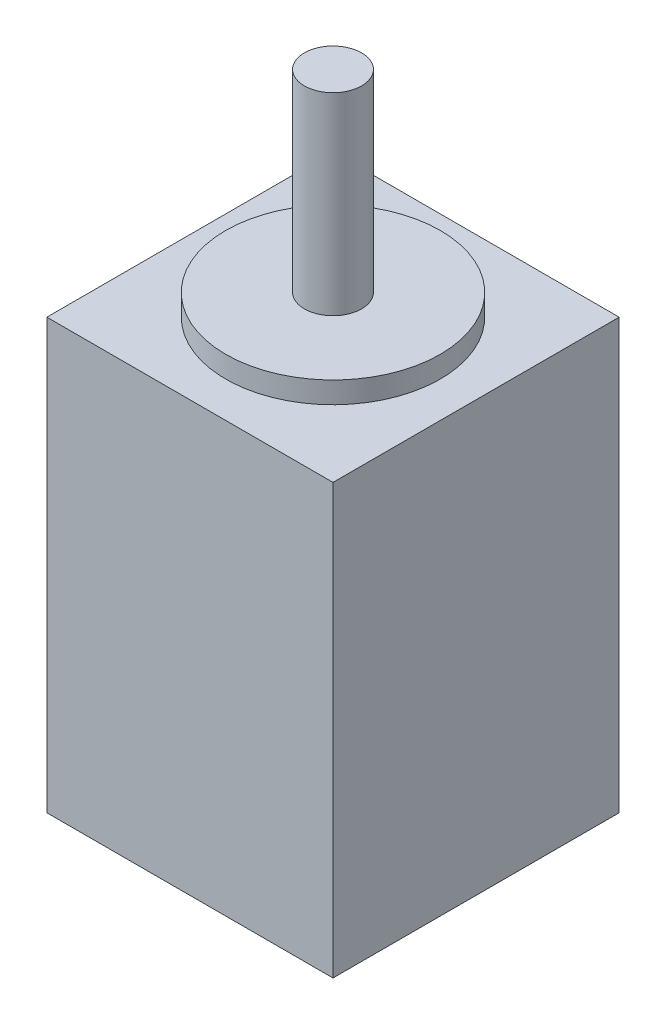
ISO-10303-21;
HEADER;
FILE_DESCRIPTION(('STEP AP214'),'2;1');
FILE_NAME('part.step','',(''),(''),'','','');
FILE_SCHEMA(('AUTOMOTIVE_DESIGN { 1 0 10303 214 1 1 1 1 }'));
ENDSEC;
DATA;
#1=APPLICATION_CONTEXT('core data for automotive mechanical design processes');
#2=APPLICATION_PROTOCOL_DEFINITION('international standard','automotive_design',2000,#1);
#3=PRODUCT_CONTEXT('',#1,'mechanical');
#4=PRODUCT('Part','Part','',(#3));
#5=PRODUCT_RELATED_PRODUCT_CATEGORY('part','',(#4));
#6=PRODUCT_DEFINITION_FORMATION('','',#4);
#7=PRODUCT_DEFINITION_CONTEXT('part definition',#1,'design');
#8=PRODUCT_DEFINITION('design','',#6,#7);
#9=PRODUCT_DEFINITION_SHAPE('','',#8);
#10=(LENGTH_UNIT() NAMED_UNIT(*) SI_UNIT(.MILLI.,.METRE.));
#11=(NAMED_UNIT(*) PLANE_ANGLE_UNIT() SI_UNIT($,.RADIAN.));
#12=(NAMED_UNIT(*) SI_UNIT($,.STERADIAN.) SOLID_ANGLE_UNIT());
#13=UNCERTAINTY_MEASURE_WITH_UNIT(LENGTH_MEASURE(1.E-05),#10,'distance_accuracy_value','');
#14=(GEOMETRIC_REPRESENTATION_CONTEXT(3) GLOBAL_UNCERTAINTY_ASSIGNED_CONTEXT((#13)) GLOBAL_UNIT_ASSIGNED_CONTEXT((#10,
#11,#12)) REPRESENTATION_CONTEXT('',''));
#15=CARTESIAN_POINT('',(0.,0.,0.));
#16=DIRECTION('',(0.,0.,1.));
#17=DIRECTION('',(1.,0.,0.));
#18=AXIS2_PLACEMENT_3D('',#15,#16,#17);
#19=CARTESIAN_POINT('',(10.,31.5,-10.));
#20=DIRECTION('',(0.,1.,0.));
#21=DIRECTION('',(0.,0.,1.));
#22=AXIS2_PLACEMENT_3D('',#19,#20,#21);
#23=PLANE('',#22);
#24=CARTESIAN_POINT('',(10.,31.5,-10.));
#25=DIRECTION('',(0.,1.,0.));
#26=DIRECTION('',(0.,0.,1.));
#27=AXIS2_PLACEMENT_3D('',#24,#25,#26);
#28=CIRCLE('',#27,7.5);
#29=CARTESIAN_POINT('',(10.,31.5,-2.5));
#30=VERTEX_POINT('',#29);
#31=EDGE_CURVE('E104',#30,#30,#28,.T.);
#32=ORIENTED_EDGE('',*,*,#31,.T.);
#33=EDGE_LOOP('',(#32));
#34=FACE_BOUND('',#33,.T.);
#35=CARTESIAN_POINT('',(10.,31.5,-10.));
#36=DIRECTION('',(0.,1.,0.));
#37=DIRECTION('',(0.,0.,1.));
#38=AXIS2_PLACEMENT_3D('',#35,#36,#37);
#39=CIRCLE('',#38,2.);
#40=CARTESIAN_POINT('',(10.,31.5,-8.));
#41=VERTEX_POINT('',#40);
#42=EDGE_CURVE('E146',#41,#41,#39,.T.);
#43=ORIENTED_EDGE('',*,*,#42,.F.);
#44=EDGE_LOOP('',(#43));
#45=FACE_BOUND('',#44,.T.);
#46=ADVANCED_FACE('F33',(#34,#45),#23,.T.);
#47=CARTESIAN_POINT('',(0.,30.,0.));
#48=DIRECTION('',(0.,-1.,0.));
#49=DIRECTION('',(0.,0.,-1.));
#50=AXIS2_PLACEMENT_3D('',#47,#48,#49);
#51=PLANE('',#50);
#52=DIRECTION('',(0.,0.,1.));
#53=VECTOR('',#52,1.);
#54=CARTESIAN_POINT('',(0.,30.,0.));
#55=LINE('',#54,#53);
#56=CARTESIAN_POINT('',(0.,30.,-20.));
#57=VERTEX_POINT('',#56);
#58=CARTESIAN_POINT('',(0.,30.,0.));
#59=VERTEX_POINT('',#58);
#60=EDGE_CURVE('E87',#57,#59,#55,.T.);
#61=ORIENTED_EDGE('',*,*,#60,.T.);
#62=DIRECTION('',(1.,0.,0.));
#63=VECTOR('',#62,1.);
#64=CARTESIAN_POINT('',(0.,30.,0.));
#65=LINE('',#64,#63);
#66=CARTESIAN_POINT('',(20.,30.,0.));
#67=VERTEX_POINT('',#66);
#68=EDGE_CURVE('E81',#59,#67,#65,.T.);
#69=ORIENTED_EDGE('',*,*,#68,.T.);
#70=DIRECTION('',(0.,0.,-1.));
#71=VECTOR('',#70,1.);
#72=CARTESIAN_POINT('',(20.,30.,0.));
#73=LINE('',#72,#71);
#74=CARTESIAN_POINT('',(20.,30.,-20.));
#75=VERTEX_POINT('',#74);
#76=EDGE_CURVE('E85',#67,#75,#73,.T.);
#77=ORIENTED_EDGE('',*,*,#76,.T.);
#78=DIRECTION('',(-1.,0.,0.));
#79=VECTOR('',#78,1.);
#80=CARTESIAN_POINT('',(0.,30.,-20.));
#81=LINE('',#80,#79);
#82=EDGE_CURVE('E50',#75,#57,#81,.T.);
#83=ORIENTED_EDGE('',*,*,#82,.T.);
#84=EDGE_LOOP('',(#61,#69,#77,#83));
#85=FACE_BOUND('',#84,.T.);
#86=CARTESIAN_POINT('',(10.,30.,-10.));
#87=DIRECTION('',(0.,-1.,0.));
#88=DIRECTION('',(0.,0.,-1.));
#89=AXIS2_PLACEMENT_3D('',#86,#87,#88);
#90=CIRCLE('',#89,7.5);
#91=CARTESIAN_POINT('',(10.,30.,-17.5));
#92=VERTEX_POINT('',#91);
#93=EDGE_CURVE('E11',#92,#92,#90,.F.);
#94=ORIENTED_EDGE('',*,*,#93,.F.);
#95=EDGE_LOOP('',(#94));
#96=FACE_BOUND('',#95,.T.);
#97=ADVANCED_FACE('F82',(#85,#96),#51,.F.);
#98=CARTESIAN_POINT('',(0.,30.,0.));
#99=DIRECTION('',(1.,0.,0.));
#100=DIRECTION('',(0.,0.,-1.));
#101=AXIS2_PLACEMENT_3D('',#98,#99,#100);
#102=PLANE('',#101);
#103=DIRECTION('',(0.,0.,1.));
#104=VECTOR('',#103,1.);
#105=CARTESIAN_POINT('',(0.,0.,0.));
#106=LINE('',#105,#104);
#107=CARTESIAN_POINT('',(0.,0.,-20.));
#108=VERTEX_POINT('',#107);
#109=CARTESIAN_POINT('',(0.,0.,0.));
#110=VERTEX_POINT('',#109);
#111=EDGE_CURVE('E101',#108,#110,#106,.T.);
#112=ORIENTED_EDGE('',*,*,#111,.T.);
#113=DIRECTION('',(0.,-1.,0.));
#114=VECTOR('',#113,1.);
#115=CARTESIAN_POINT('',(0.,30.,0.));
#116=LINE('',#115,#114);
#117=EDGE_CURVE('E42',#59,#110,#116,.T.);
#118=ORIENTED_EDGE('',*,*,#117,.F.);
#119=ORIENTED_EDGE('',*,*,#60,.F.);
#120=DIRECTION('',(0.,-1.,0.));
#121=VECTOR('',#120,1.);
#122=CARTESIAN_POINT('',(0.,30.,-20.));
#123=LINE('',#122,#121);
#124=EDGE_CURVE('E97',#57,#108,#123,.T.);
#125=ORIENTED_EDGE('',*,*,#124,.T.);
#126=EDGE_LOOP('',(#112,#118,#119,#125));
#127=FACE_BOUND('',#126,.T.);
#128=ADVANCED_FACE('F35',(#127),#102,.F.);
#129=CARTESIAN_POINT('',(0.,30.,0.));
#130=DIRECTION('',(0.,0.,-1.));
#131=DIRECTION('',(-1.,0.,0.));
#132=AXIS2_PLACEMENT_3D('',#129,#130,#131);
#133=PLANE('',#132);
#134=DIRECTION('',(1.,0.,0.));
#135=VECTOR('',#134,1.);
#136=CARTESIAN_POINT('',(0.,0.,0.));
#137=LINE('',#136,#135);
#138=CARTESIAN_POINT('',(20.,0.,0.));
#139=VERTEX_POINT('',#138);
#140=EDGE_CURVE('E92',#110,#139,#137,.T.);
#141=ORIENTED_EDGE('',*,*,#140,.T.);
#142=DIRECTION('',(0.,-1.,0.));
#143=VECTOR('',#142,1.);
#144=CARTESIAN_POINT('',(20.,30.,0.));
#145=LINE('',#144,#143);
#146=EDGE_CURVE('E90',#67,#139,#145,.T.);
#147=ORIENTED_EDGE('',*,*,#146,.F.);
#148=ORIENTED_EDGE('',*,*,#68,.F.);
#149=ORIENTED_EDGE('',*,*,#117,.T.);
#150=EDGE_LOOP('',(#141,#147,#148,#149));
#151=FACE_BOUND('',#150,.T.);
#152=ADVANCED_FACE('F91',(#151),#133,.F.);
#153=CARTESIAN_POINT('',(20.,30.,0.));
#154=DIRECTION('',(-1.,0.,0.));
#155=DIRECTION('',(0.,0.,1.));
#156=AXIS2_PLACEMENT_3D('',#153,#154,#155);
#157=PLANE('',#156);
#158=DIRECTION('',(0.,0.,-1.));
#159=VECTOR('',#158,1.);
#160=CARTESIAN_POINT('',(20.,0.,0.));
#161=LINE('',#160,#159);
#162=CARTESIAN_POINT('',(20.,0.,-20.));
#163=VERTEX_POINT('',#162);
#164=EDGE_CURVE('E67',#139,#163,#161,.T.);
#165=ORIENTED_EDGE('',*,*,#164,.T.);
#166=DIRECTION('',(0.,-1.,0.));
#167=VECTOR('',#166,1.);
#168=CARTESIAN_POINT('',(20.,30.,-20.));
#169=LINE('',#168,#167);
#170=EDGE_CURVE('E93',#75,#163,#169,.T.);
#171=ORIENTED_EDGE('',*,*,#170,.F.);
#172=ORIENTED_EDGE('',*,*,#76,.F.);
#173=ORIENTED_EDGE('',*,*,#146,.T.);
#174=EDGE_LOOP('',(#165,#171,#172,#173));
#175=FACE_BOUND('',#174,.T.);
#176=ADVANCED_FACE('F95',(#175),#157,.F.);
#177=CARTESIAN_POINT('',(0.,30.,-20.));
#178=DIRECTION('',(0.,0.,1.));
#179=DIRECTION('',(1.,0.,0.));
#180=AXIS2_PLACEMENT_3D('',#177,#178,#179);
#181=PLANE('',#180);
#182=DIRECTION('',(-1.,0.,0.));
#183=VECTOR('',#182,1.);
#184=CARTESIAN_POINT('',(0.,0.,-20.));
#185=LINE('',#184,#183);
#186=EDGE_CURVE('E73',#163,#108,#185,.T.);
#187=ORIENTED_EDGE('',*,*,#186,.T.);
#188=ORIENTED_EDGE('',*,*,#124,.F.);
#189=ORIENTED_EDGE('',*,*,#82,.F.);
#190=ORIENTED_EDGE('',*,*,#170,.T.);
#191=EDGE_LOOP('',(#187,#188,#189,#190));
#192=FACE_BOUND('',#191,.T.);
#193=ADVANCED_FACE('F115',(#192),#181,.F.);
#194=CARTESIAN_POINT('',(0.,0.,0.));
#195=DIRECTION('',(0.,-1.,0.));
#196=DIRECTION('',(0.,0.,-1.));
#197=AXIS2_PLACEMENT_3D('',#194,#195,#196);
#198=PLANE('',#197);
#199=ORIENTED_EDGE('',*,*,#111,.F.);
#200=ORIENTED_EDGE('',*,*,#186,.F.);
#201=ORIENTED_EDGE('',*,*,#164,.F.);
#202=ORIENTED_EDGE('',*,*,#140,.F.);
#203=EDGE_LOOP('',(#199,#200,#201,#202));
#204=FACE_BOUND('',#203,.T.);
#205=ADVANCED_FACE('F112',(#204),#198,.T.);
#206=CARTESIAN_POINT('',(10.,31.5,-10.));
#207=DIRECTION('',(0.,-1.,0.));
#208=DIRECTION('',(0.,0.,-1.));
#209=AXIS2_PLACEMENT_3D('',#206,#207,#208);
#210=CYLINDRICAL_SURFACE('',#209,7.5);
#211=ORIENTED_EDGE('',*,*,#31,.F.);
#212=EDGE_LOOP('',(#211));
#213=FACE_BOUND('',#212,.T.);
#214=ORIENTED_EDGE('',*,*,#93,.T.);
#215=EDGE_LOOP('',(#214));
#216=FACE_BOUND('',#215,.T.);
#217=ADVANCED_FACE('F114',(#213,#216),#210,.T.);
#218=CARTESIAN_POINT('',(10.,45.,-10.));
#219=DIRECTION('',(0.,-1.,0.));
#220=DIRECTION('',(0.,0.,-1.));
#221=AXIS2_PLACEMENT_3D('',#218,#219,#220);
#222=CYLINDRICAL_SURFACE('',#221,2.);
#223=CARTESIAN_POINT('',(10.,45.,-10.));
#224=DIRECTION('',(0.,1.,0.));
#225=DIRECTION('',(0.,0.,1.));
#226=AXIS2_PLACEMENT_3D('',#223,#224,#225);
#227=CIRCLE('',#226,2.);
#228=CARTESIAN_POINT('',(10.,45.,-8.));
#229=VERTEX_POINT('',#228);
#230=EDGE_CURVE('E145',#229,#229,#227,.T.);
#231=ORIENTED_EDGE('',*,*,#230,.F.);
#232=EDGE_LOOP('',(#231));
#233=FACE_BOUND('',#232,.T.);
#234=ORIENTED_EDGE('',*,*,#42,.T.);
#235=EDGE_LOOP('',(#234));
#236=FACE_BOUND('',#235,.T.);
#237=ADVANCED_FACE('F121',(#233,#236),#222,.T.);
#238=CARTESIAN_POINT('',(10.,45.,-10.));
#239=DIRECTION('',(0.,1.,0.));
#240=DIRECTION('',(0.,0.,1.));
#241=AXIS2_PLACEMENT_3D('',#238,#239,#240);
#242=PLANE('',#241);
#243=ORIENTED_EDGE('',*,*,#230,.T.);
#244=EDGE_LOOP('',(#243));
#245=FACE_BOUND('',#244,.T.);
#246=ADVANCED_FACE('F137',(#245),#242,.T.);
#247=CLOSED_SHELL('',(#46,#97,#128,#152,#176,#193,#205,#217,#237,#246));
#248=MANIFOLD_SOLID_BREP('B2',#247);
#249=ADVANCED_BREP_SHAPE_REPRESENTATION('',(#18,#248),#14);
#250=SHAPE_DEFINITION_REPRESENTATION(#9,#249);
ENDSEC;
END-ISO-10303-21;
